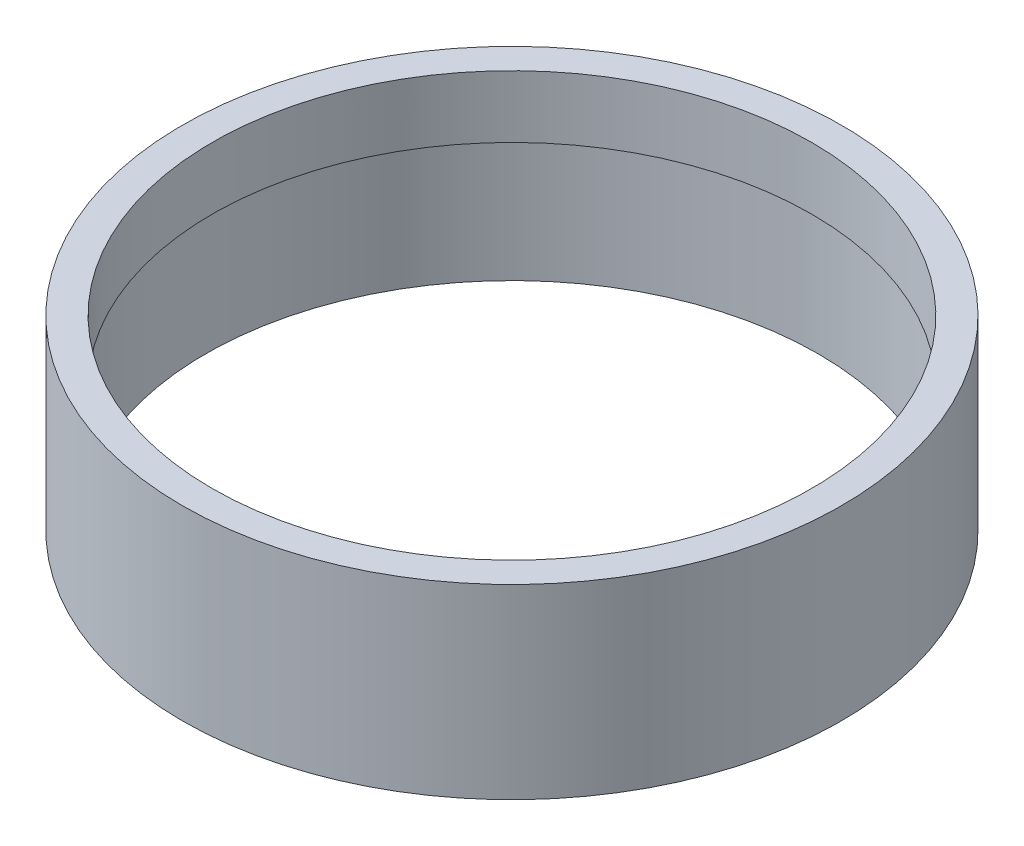
ISO-10303-21;
HEADER;
FILE_DESCRIPTION(('STEP AP214'),'2;1');
FILE_NAME('part.step','',(''),(''),'','','');
FILE_SCHEMA(('AUTOMOTIVE_DESIGN { 1 0 10303 214 1 1 1 1 }'));
ENDSEC;
DATA;
#1=APPLICATION_CONTEXT('core data for automotive mechanical design processes');
#2=APPLICATION_PROTOCOL_DEFINITION('international standard','automotive_design',2000,#1);
#3=PRODUCT_CONTEXT('',#1,'mechanical');
#4=PRODUCT('Part','Part','',(#3));
#5=PRODUCT_RELATED_PRODUCT_CATEGORY('part','',(#4));
#6=PRODUCT_DEFINITION_FORMATION('','',#4);
#7=PRODUCT_DEFINITION_CONTEXT('part definition',#1,'design');
#8=PRODUCT_DEFINITION('design','',#6,#7);
#9=PRODUCT_DEFINITION_SHAPE('','',#8);
#10=(LENGTH_UNIT() NAMED_UNIT(*) SI_UNIT(.MILLI.,.METRE.));
#11=(NAMED_UNIT(*) PLANE_ANGLE_UNIT() SI_UNIT($,.RADIAN.));
#12=(NAMED_UNIT(*) SI_UNIT($,.STERADIAN.) SOLID_ANGLE_UNIT());
#13=UNCERTAINTY_MEASURE_WITH_UNIT(LENGTH_MEASURE(1.E-05),#10,'distance_accuracy_value','');
#14=(GEOMETRIC_REPRESENTATION_CONTEXT(3) GLOBAL_UNCERTAINTY_ASSIGNED_CONTEXT((#13)) GLOBAL_UNIT_ASSIGNED_CONTEXT((#10,
#11,#12)) REPRESENTATION_CONTEXT('',''));
#15=CARTESIAN_POINT('',(0.,0.,0.));
#16=DIRECTION('',(0.,0.,1.));
#17=DIRECTION('',(1.,0.,0.));
#18=AXIS2_PLACEMENT_3D('',#15,#16,#17);
#19=CARTESIAN_POINT('',(0.,15.,0.));
#20=DIRECTION('',(0.,-1.,0.));
#21=DIRECTION('',(0.,0.,-1.));
#22=AXIS2_PLACEMENT_3D('',#19,#20,#21);
#23=CYLINDRICAL_SURFACE('',#22,24.125);
#24=CARTESIAN_POINT('',(0.,15.,0.));
#25=DIRECTION('',(0.,1.,0.));
#26=DIRECTION('',(0.,0.,1.));
#27=AXIS2_PLACEMENT_3D('',#24,#25,#26);
#28=CIRCLE('',#27,24.125);
#29=CARTESIAN_POINT('',(0.,15.,24.125));
#30=VERTEX_POINT('',#29);
#31=EDGE_CURVE('E48',#30,#30,#28,.T.);
#32=ORIENTED_EDGE('',*,*,#31,.T.);
#33=EDGE_LOOP('',(#32));
#34=FACE_BOUND('',#33,.T.);
#35=CARTESIAN_POINT('',(0.,10.,0.));
#36=DIRECTION('',(0.,-1.,0.));
#37=DIRECTION('',(0.,0.,-1.));
#38=AXIS2_PLACEMENT_3D('',#35,#36,#37);
#39=CIRCLE('',#38,24.125);
#40=CARTESIAN_POINT('',(0.,10.,-24.125));
#41=VERTEX_POINT('',#40);
#42=EDGE_CURVE('E39',#41,#41,#39,.T.);
#43=ORIENTED_EDGE('',*,*,#42,.T.);
#44=EDGE_LOOP('',(#43));
#45=FACE_BOUND('',#44,.T.);
#46=ADVANCED_FACE('F35',(#34,#45),#23,.F.);
#47=CARTESIAN_POINT('',(0.,15.,0.));
#48=DIRECTION('',(0.,1.,0.));
#49=DIRECTION('',(0.,0.,1.));
#50=AXIS2_PLACEMENT_3D('',#47,#48,#49);
#51=PLANE('',#50);
#52=CARTESIAN_POINT('',(0.,15.,0.));
#53=DIRECTION('',(0.,1.,0.));
#54=DIRECTION('',(0.,0.,1.));
#55=AXIS2_PLACEMENT_3D('',#52,#53,#54);
#56=CIRCLE('',#55,26.525);
#57=CARTESIAN_POINT('',(0.,15.,26.525));
#58=VERTEX_POINT('',#57);
#59=EDGE_CURVE('E10',#58,#58,#56,.T.);
#60=ORIENTED_EDGE('',*,*,#59,.T.);
#61=EDGE_LOOP('',(#60));
#62=FACE_BOUND('',#61,.T.);
#63=ORIENTED_EDGE('',*,*,#31,.F.);
#64=EDGE_LOOP('',(#63));
#65=FACE_BOUND('',#64,.T.);
#66=ADVANCED_FACE('F73',(#62,#65),#51,.T.);
#67=CARTESIAN_POINT('',(0.,0.,0.));
#68=DIRECTION('',(0.,1.,0.));
#69=DIRECTION('',(0.,0.,1.));
#70=AXIS2_PLACEMENT_3D('',#67,#68,#69);
#71=PLANE('',#70);
#72=CARTESIAN_POINT('',(0.,0.,0.));
#73=DIRECTION('',(0.,-1.,0.));
#74=DIRECTION('',(0.,0.,-1.));
#75=AXIS2_PLACEMENT_3D('',#72,#73,#74);
#76=CIRCLE('',#75,24.65);
#77=CARTESIAN_POINT('',(0.,0.,-24.65));
#78=VERTEX_POINT('',#77);
#79=EDGE_CURVE('E52',#78,#78,#76,.T.);
#80=ORIENTED_EDGE('',*,*,#79,.F.);
#81=EDGE_LOOP('',(#80));
#82=FACE_BOUND('',#81,.T.);
#83=CARTESIAN_POINT('',(0.,0.,0.));
#84=DIRECTION('',(0.,1.,0.));
#85=DIRECTION('',(0.,0.,1.));
#86=AXIS2_PLACEMENT_3D('',#83,#84,#85);
#87=CIRCLE('',#86,26.525);
#88=CARTESIAN_POINT('',(0.,0.,26.525));
#89=VERTEX_POINT('',#88);
#90=EDGE_CURVE('E43',#89,#89,#87,.T.);
#91=ORIENTED_EDGE('',*,*,#90,.F.);
#92=EDGE_LOOP('',(#91));
#93=FACE_BOUND('',#92,.T.);
#94=ADVANCED_FACE('F79',(#82,#93),#71,.F.);
#95=CARTESIAN_POINT('',(0.,15.,0.));
#96=DIRECTION('',(0.,-1.,0.));
#97=DIRECTION('',(0.,0.,-1.));
#98=AXIS2_PLACEMENT_3D('',#95,#96,#97);
#99=CYLINDRICAL_SURFACE('',#98,26.525);
#100=ORIENTED_EDGE('',*,*,#59,.F.);
#101=EDGE_LOOP('',(#100));
#102=FACE_BOUND('',#101,.T.);
#103=ORIENTED_EDGE('',*,*,#90,.T.);
#104=EDGE_LOOP('',(#103));
#105=FACE_BOUND('',#104,.T.);
#106=ADVANCED_FACE('F37',(#102,#105),#99,.T.);
#107=CARTESIAN_POINT('',(0.,10.,0.));
#108=DIRECTION('',(0.,-1.,0.));
#109=DIRECTION('',(0.,0.,-1.));
#110=AXIS2_PLACEMENT_3D('',#107,#108,#109);
#111=CYLINDRICAL_SURFACE('',#110,24.65);
#112=CARTESIAN_POINT('',(0.,10.,0.));
#113=DIRECTION('',(0.,-1.,0.));
#114=DIRECTION('',(0.,0.,-1.));
#115=AXIS2_PLACEMENT_3D('',#112,#113,#114);
#116=CIRCLE('',#115,24.65);
#117=CARTESIAN_POINT('',(0.,10.,-24.65));
#118=VERTEX_POINT('',#117);
#119=EDGE_CURVE('E55',#118,#118,#116,.T.);
#120=ORIENTED_EDGE('',*,*,#119,.F.);
#121=EDGE_LOOP('',(#120));
#122=FACE_BOUND('',#121,.T.);
#123=ORIENTED_EDGE('',*,*,#79,.T.);
#124=EDGE_LOOP('',(#123));
#125=FACE_BOUND('',#124,.T.);
#126=ADVANCED_FACE('F65',(#122,#125),#111,.F.);
#127=CARTESIAN_POINT('',(0.,10.,0.));
#128=DIRECTION('',(0.,-1.,0.));
#129=DIRECTION('',(0.,0.,-1.));
#130=AXIS2_PLACEMENT_3D('',#127,#128,#129);
#131=PLANE('',#130);
#132=ORIENTED_EDGE('',*,*,#42,.F.);
#133=EDGE_LOOP('',(#132));
#134=FACE_BOUND('',#133,.T.);
#135=ORIENTED_EDGE('',*,*,#119,.T.);
#136=EDGE_LOOP('',(#135));
#137=FACE_BOUND('',#136,.T.);
#138=ADVANCED_FACE('F63',(#134,#137),#131,.T.);
#139=CLOSED_SHELL('',(#46,#66,#94,#106,#126,#138));
#140=MANIFOLD_SOLID_BREP('B2',#139);
#141=ADVANCED_BREP_SHAPE_REPRESENTATION('',(#18,#140),#14);
#142=SHAPE_DEFINITION_REPRESENTATION(#9,#141);
ENDSEC;
END-ISO-10303-21;
